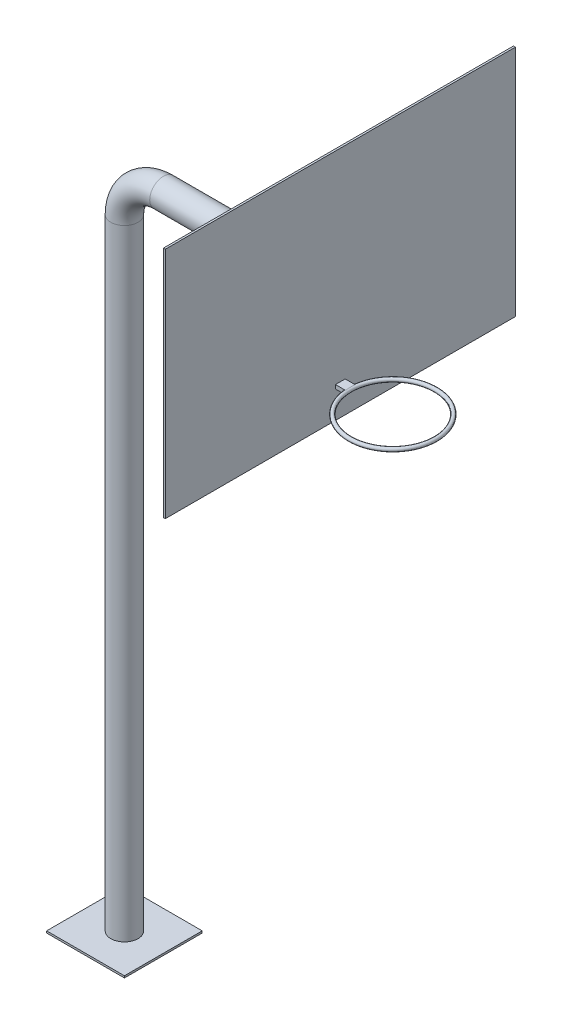
ISO-10303-21;
HEADER;
FILE_DESCRIPTION(('STEP AP214'),'2;1');
FILE_NAME('part.step','',(''),(''),'','','');
FILE_SCHEMA(('AUTOMOTIVE_DESIGN { 1 0 10303 214 1 1 1 1 }'));
ENDSEC;
DATA;
#1=APPLICATION_CONTEXT('core data for automotive mechanical design processes');
#2=APPLICATION_PROTOCOL_DEFINITION('international standard','automotive_design',2000,#1);
#3=PRODUCT_CONTEXT('',#1,'mechanical');
#4=PRODUCT('Part','Part','',(#3));
#5=PRODUCT_RELATED_PRODUCT_CATEGORY('part','',(#4));
#6=PRODUCT_DEFINITION_FORMATION('','',#4);
#7=PRODUCT_DEFINITION_CONTEXT('part definition',#1,'design');
#8=PRODUCT_DEFINITION('design','',#6,#7);
#9=PRODUCT_DEFINITION_SHAPE('','',#8);
#10=(LENGTH_UNIT() NAMED_UNIT(*) SI_UNIT(.MILLI.,.METRE.));
#11=(NAMED_UNIT(*) PLANE_ANGLE_UNIT() SI_UNIT($,.RADIAN.));
#12=(NAMED_UNIT(*) SI_UNIT($,.STERADIAN.) SOLID_ANGLE_UNIT());
#13=UNCERTAINTY_MEASURE_WITH_UNIT(LENGTH_MEASURE(1.E-05),#10,'distance_accuracy_value','');
#14=(GEOMETRIC_REPRESENTATION_CONTEXT(3) GLOBAL_UNCERTAINTY_ASSIGNED_CONTEXT((#13)) GLOBAL_UNIT_ASSIGNED_CONTEXT((#10,
#11,#12)) REPRESENTATION_CONTEXT('',''));
#15=CARTESIAN_POINT('',(0.,0.,0.));
#16=DIRECTION('',(0.,0.,1.));
#17=DIRECTION('',(1.,0.,0.));
#18=AXIS2_PLACEMENT_3D('',#15,#16,#17);
#19=CARTESIAN_POINT('',(1110.,6.15556988097725E-13,0.));
#20=DIRECTION('',(1.,0.,0.));
#21=DIRECTION('',(0.,1.,0.));
#22=AXIS2_PLACEMENT_3D('',#19,#20,#21);
#23=PLANE('',#22);
#24=DIRECTION('',(0.,1.,0.));
#25=VECTOR('',#24,1.);
#26=CARTESIAN_POINT('',(1110.,4050.,-900.));
#27=LINE('',#26,#25);
#28=CARTESIAN_POINT('',(1110.,2850.,-900.));
#29=VERTEX_POINT('',#28);
#30=CARTESIAN_POINT('',(1110.,4050.,-900.));
#31=VERTEX_POINT('',#30);
#32=EDGE_CURVE('E499',#29,#31,#27,.T.);
#33=ORIENTED_EDGE('',*,*,#32,.T.);
#34=DIRECTION('',(0.,0.,1.));
#35=VECTOR('',#34,1.);
#36=CARTESIAN_POINT('',(1110.,4050.,900.));
#37=LINE('',#36,#35);
#38=CARTESIAN_POINT('',(1110.,4050.,900.));
#39=VERTEX_POINT('',#38);
#40=EDGE_CURVE('E502',#31,#39,#37,.T.);
#41=ORIENTED_EDGE('',*,*,#40,.T.);
#42=DIRECTION('',(0.,-1.,0.));
#43=VECTOR('',#42,1.);
#44=CARTESIAN_POINT('',(1110.,4050.,900.));
#45=LINE('',#44,#43);
#46=CARTESIAN_POINT('',(1110.,2850.,900.));
#47=VERTEX_POINT('',#46);
#48=EDGE_CURVE('E505',#39,#47,#45,.T.);
#49=ORIENTED_EDGE('',*,*,#48,.T.);
#50=DIRECTION('',(0.,0.,-1.));
#51=VECTOR('',#50,1.);
#52=CARTESIAN_POINT('',(1110.,2850.,900.));
#53=LINE('',#52,#51);
#54=EDGE_CURVE('E507',#47,#29,#53,.T.);
#55=ORIENTED_EDGE('',*,*,#54,.T.);
#56=EDGE_LOOP('',(#33,#41,#49,#55));
#57=FACE_BOUND('',#56,.T.);
#58=DIRECTION('',(0.,-1.,0.));
#59=VECTOR('',#58,1.);
#60=CARTESIAN_POINT('',(1110.,3010.,25.0000000000003));
#61=LINE('',#60,#59);
#62=CARTESIAN_POINT('',(1110.,3010.,25.0000000000003));
#63=VERTEX_POINT('',#62);
#64=CARTESIAN_POINT('',(1110.,2990.,25.0000000000003));
#65=VERTEX_POINT('',#64);
#66=EDGE_CURVE('E55',#63,#65,#61,.T.);
#67=ORIENTED_EDGE('',*,*,#66,.F.);
#68=DIRECTION('',(0.,0.,1.));
#69=VECTOR('',#68,1.);
#70=CARTESIAN_POINT('',(1110.,3010.,25.0000000000003));
#71=LINE('',#70,#69);
#72=CARTESIAN_POINT('',(1110.,3010.,-24.9999999999997));
#73=VERTEX_POINT('',#72);
#74=EDGE_CURVE('E162',#73,#63,#71,.T.);
#75=ORIENTED_EDGE('',*,*,#74,.F.);
#76=DIRECTION('',(0.,1.,0.));
#77=VECTOR('',#76,1.);
#78=CARTESIAN_POINT('',(1110.,3010.,-24.9999999999997));
#79=LINE('',#78,#77);
#80=CARTESIAN_POINT('',(1110.,2990.,-24.9999999999997));
#81=VERTEX_POINT('',#80);
#82=EDGE_CURVE('E514',#81,#73,#79,.T.);
#83=ORIENTED_EDGE('',*,*,#82,.F.);
#84=DIRECTION('',(0.,0.,-1.));
#85=VECTOR('',#84,1.);
#86=CARTESIAN_POINT('',(1110.,2990.,25.0000000000003));
#87=LINE('',#86,#85);
#88=EDGE_CURVE('E160',#65,#81,#87,.T.);
#89=ORIENTED_EDGE('',*,*,#88,.F.);
#90=EDGE_LOOP('',(#67,#75,#83,#89));
#91=FACE_BOUND('',#90,.T.);
#92=ADVANCED_FACE('F37',(#57,#91),#23,.T.);
#93=CARTESIAN_POINT('',(0.,10.,0.));
#94=DIRECTION('',(0.,1.,0.));
#95=DIRECTION('',(0.,0.,1.));
#96=AXIS2_PLACEMENT_3D('',#93,#94,#95);
#97=PLANE('',#96);
#98=DIRECTION('',(0.,0.,-1.));
#99=VECTOR('',#98,1.);
#100=CARTESIAN_POINT('',(200.,10.,-200.));
#101=LINE('',#100,#99);
#102=CARTESIAN_POINT('',(200.,10.,200.));
#103=VERTEX_POINT('',#102);
#104=CARTESIAN_POINT('',(200.,10.,-200.));
#105=VERTEX_POINT('',#104);
#106=EDGE_CURVE('E275',#103,#105,#101,.T.);
#107=ORIENTED_EDGE('',*,*,#106,.T.);
#108=DIRECTION('',(-1.,0.,0.));
#109=VECTOR('',#108,1.);
#110=CARTESIAN_POINT('',(-200.,10.,-200.));
#111=LINE('',#110,#109);
#112=CARTESIAN_POINT('',(-200.,10.,-200.));
#113=VERTEX_POINT('',#112);
#114=EDGE_CURVE('E93',#105,#113,#111,.T.);
#115=ORIENTED_EDGE('',*,*,#114,.T.);
#116=DIRECTION('',(0.,0.,1.));
#117=VECTOR('',#116,1.);
#118=CARTESIAN_POINT('',(-200.,10.,-200.));
#119=LINE('',#118,#117);
#120=CARTESIAN_POINT('',(-200.,10.,200.));
#121=VERTEX_POINT('',#120);
#122=EDGE_CURVE('E272',#113,#121,#119,.T.);
#123=ORIENTED_EDGE('',*,*,#122,.T.);
#124=DIRECTION('',(1.,0.,0.));
#125=VECTOR('',#124,1.);
#126=CARTESIAN_POINT('',(-200.,10.,200.));
#127=LINE('',#126,#125);
#128=EDGE_CURVE('E64',#121,#103,#127,.T.);
#129=ORIENTED_EDGE('',*,*,#128,.T.);
#130=EDGE_LOOP('',(#107,#115,#123,#129));
#131=FACE_BOUND('',#130,.T.);
#132=CARTESIAN_POINT('',(0.,10.,0.));
#133=DIRECTION('',(0.,1.,0.));
#134=DIRECTION('',(0.,0.,1.));
#135=AXIS2_PLACEMENT_3D('',#132,#133,#134);
#136=CIRCLE('',#135,70.);
#137=CARTESIAN_POINT('',(0.,10.,70.));
#138=VERTEX_POINT('',#137);
#139=EDGE_CURVE('E11',#138,#138,#136,.T.);
#140=ORIENTED_EDGE('',*,*,#139,.F.);
#141=EDGE_LOOP('',(#140));
#142=FACE_BOUND('',#141,.T.);
#143=ADVANCED_FACE('F192',(#131,#142),#97,.T.);
#144=CARTESIAN_POINT('',(200.,10.,-200.));
#145=DIRECTION('',(-1.,0.,0.));
#146=DIRECTION('',(0.,0.,1.));
#147=AXIS2_PLACEMENT_3D('',#144,#145,#146);
#148=PLANE('',#147);
#149=DIRECTION('',(0.,0.,-1.));
#150=VECTOR('',#149,1.);
#151=CARTESIAN_POINT('',(200.,0.,-200.));
#152=LINE('',#151,#150);
#153=CARTESIAN_POINT('',(200.,0.,200.));
#154=VERTEX_POINT('',#153);
#155=CARTESIAN_POINT('',(200.,0.,-200.));
#156=VERTEX_POINT('',#155);
#157=EDGE_CURVE('E269',#154,#156,#152,.T.);
#158=ORIENTED_EDGE('',*,*,#157,.T.);
#159=DIRECTION('',(0.,-1.,0.));
#160=VECTOR('',#159,1.);
#161=CARTESIAN_POINT('',(200.,10.,-200.));
#162=LINE('',#161,#160);
#163=EDGE_CURVE('E41',#105,#156,#162,.T.);
#164=ORIENTED_EDGE('',*,*,#163,.F.);
#165=ORIENTED_EDGE('',*,*,#106,.F.);
#166=DIRECTION('',(0.,-1.,0.));
#167=VECTOR('',#166,1.);
#168=CARTESIAN_POINT('',(200.,10.,200.));
#169=LINE('',#168,#167);
#170=EDGE_CURVE('E279',#103,#154,#169,.T.);
#171=ORIENTED_EDGE('',*,*,#170,.T.);
#172=EDGE_LOOP('',(#158,#164,#165,#171));
#173=FACE_BOUND('',#172,.T.);
#174=ADVANCED_FACE('F39',(#173),#148,.F.);
#175=CARTESIAN_POINT('',(-200.,10.,-200.));
#176=DIRECTION('',(0.,0.,1.));
#177=DIRECTION('',(1.,0.,0.));
#178=AXIS2_PLACEMENT_3D('',#175,#176,#177);
#179=PLANE('',#178);
#180=DIRECTION('',(-1.,0.,0.));
#181=VECTOR('',#180,1.);
#182=CARTESIAN_POINT('',(-200.,0.,-200.));
#183=LINE('',#182,#181);
#184=CARTESIAN_POINT('',(-200.,0.,-200.));
#185=VERTEX_POINT('',#184);
#186=EDGE_CURVE('E260',#156,#185,#183,.T.);
#187=ORIENTED_EDGE('',*,*,#186,.T.);
#188=DIRECTION('',(0.,-1.,0.));
#189=VECTOR('',#188,1.);
#190=CARTESIAN_POINT('',(-200.,10.,-200.));
#191=LINE('',#190,#189);
#192=EDGE_CURVE('E262',#113,#185,#191,.T.);
#193=ORIENTED_EDGE('',*,*,#192,.F.);
#194=ORIENTED_EDGE('',*,*,#114,.F.);
#195=ORIENTED_EDGE('',*,*,#163,.T.);
#196=EDGE_LOOP('',(#187,#193,#194,#195));
#197=FACE_BOUND('',#196,.T.);
#198=ADVANCED_FACE('F253',(#197),#179,.F.);
#199=CARTESIAN_POINT('',(-200.,10.,-200.));
#200=DIRECTION('',(1.,0.,0.));
#201=DIRECTION('',(0.,0.,-1.));
#202=AXIS2_PLACEMENT_3D('',#199,#200,#201);
#203=PLANE('',#202);
#204=DIRECTION('',(0.,0.,1.));
#205=VECTOR('',#204,1.);
#206=CARTESIAN_POINT('',(-200.,0.,-200.));
#207=LINE('',#206,#205);
#208=CARTESIAN_POINT('',(-200.,0.,200.));
#209=VERTEX_POINT('',#208);
#210=EDGE_CURVE('E268',#185,#209,#207,.T.);
#211=ORIENTED_EDGE('',*,*,#210,.T.);
#212=DIRECTION('',(0.,-1.,0.));
#213=VECTOR('',#212,1.);
#214=CARTESIAN_POINT('',(-200.,10.,200.));
#215=LINE('',#214,#213);
#216=EDGE_CURVE('E273',#121,#209,#215,.T.);
#217=ORIENTED_EDGE('',*,*,#216,.F.);
#218=ORIENTED_EDGE('',*,*,#122,.F.);
#219=ORIENTED_EDGE('',*,*,#192,.T.);
#220=EDGE_LOOP('',(#211,#217,#218,#219));
#221=FACE_BOUND('',#220,.T.);
#222=ADVANCED_FACE('F251',(#221),#203,.F.);
#223=CARTESIAN_POINT('',(-200.,10.,200.));
#224=DIRECTION('',(0.,0.,-1.));
#225=DIRECTION('',(-1.,0.,0.));
#226=AXIS2_PLACEMENT_3D('',#223,#224,#225);
#227=PLANE('',#226);
#228=DIRECTION('',(1.,0.,0.));
#229=VECTOR('',#228,1.);
#230=CARTESIAN_POINT('',(-200.,0.,200.));
#231=LINE('',#230,#229);
#232=EDGE_CURVE('E85',#209,#154,#231,.T.);
#233=ORIENTED_EDGE('',*,*,#232,.T.);
#234=ORIENTED_EDGE('',*,*,#170,.F.);
#235=ORIENTED_EDGE('',*,*,#128,.F.);
#236=ORIENTED_EDGE('',*,*,#216,.T.);
#237=EDGE_LOOP('',(#233,#234,#235,#236));
#238=FACE_BOUND('',#237,.T.);
#239=ADVANCED_FACE('F247',(#238),#227,.F.);
#240=CARTESIAN_POINT('',(0.,0.,0.));
#241=DIRECTION('',(0.,1.,0.));
#242=DIRECTION('',(0.,0.,1.));
#243=AXIS2_PLACEMENT_3D('',#240,#241,#242);
#244=PLANE('',#243);
#245=ORIENTED_EDGE('',*,*,#157,.F.);
#246=ORIENTED_EDGE('',*,*,#232,.F.);
#247=ORIENTED_EDGE('',*,*,#210,.F.);
#248=ORIENTED_EDGE('',*,*,#186,.F.);
#249=EDGE_LOOP('',(#245,#246,#247,#248));
#250=FACE_BOUND('',#249,.T.);
#251=ADVANCED_FACE('F235',(#250),#244,.F.);
#252=CARTESIAN_POINT('',(0.,0.,0.));
#253=DIRECTION('',(0.,1.,0.));
#254=DIRECTION('',(0.,0.,1.));
#255=AXIS2_PLACEMENT_3D('',#252,#253,#254);
#256=CYLINDRICAL_SURFACE('',#255,70.);
#257=ORIENTED_EDGE('',*,*,#139,.T.);
#258=EDGE_LOOP('',(#257));
#259=FACE_BOUND('',#258,.T.);
#260=CARTESIAN_POINT('',(0.,3200.,0.));
#261=DIRECTION('',(0.,1.,0.));
#262=DIRECTION('',(0.,0.,1.));
#263=AXIS2_PLACEMENT_3D('',#260,#261,#262);
#264=CIRCLE('',#263,70.);
#265=CARTESIAN_POINT('',(-70.0000000000001,3200.,0.));
#266=VERTEX_POINT('',#265);
#267=EDGE_CURVE('E300',#266,#266,#264,.T.);
#268=ORIENTED_EDGE('',*,*,#267,.F.);
#269=EDGE_LOOP('',(#268));
#270=FACE_BOUND('',#269,.T.);
#271=ADVANCED_FACE('F201',(#259,#270),#256,.T.);
#272=CARTESIAN_POINT('',(200.,3200.,0.));
#273=DIRECTION('',(0.,0.,-1.));
#274=DIRECTION('',(-1.,0.,0.));
#275=AXIS2_PLACEMENT_3D('',#272,#273,#274);
#276=TOROIDAL_SURFACE('',#275,200.,70.);
#277=CARTESIAN_POINT('',(200.,3400.,0.));
#278=DIRECTION('',(1.,0.,0.));
#279=DIRECTION('',(0.,0.,1.));
#280=AXIS2_PLACEMENT_3D('',#277,#278,#279);
#281=CIRCLE('',#280,70.);
#282=CARTESIAN_POINT('',(200.,3470.,0.));
#283=VERTEX_POINT('',#282);
#284=EDGE_CURVE('E299',#283,#283,#281,.T.);
#285=CARTESIAN_POINT('',(200.,3200.,0.));
#286=DIRECTION('',(0.,0.,-1.));
#287=DIRECTION('',(-1.,0.,0.));
#288=AXIS2_PLACEMENT_3D('',#285,#286,#287);
#289=CIRCLE('',#288,270.);
#290=EDGE_CURVE('',#266,#283,#289,.T.);
#291=ORIENTED_EDGE('',*,*,#267,.T.);
#292=ORIENTED_EDGE('',*,*,#284,.F.);
#293=ORIENTED_EDGE('',*,*,#290,.T.);
#294=ORIENTED_EDGE('',*,*,#290,.F.);
#295=EDGE_LOOP('',(#291,#293,#292,#294));
#296=FACE_BOUND('',#295,.T.);
#297=ADVANCED_FACE('F234',(#296),#276,.T.);
#298=CARTESIAN_POINT('',(200.,3400.,0.));
#299=DIRECTION('',(1.,0.,0.));
#300=DIRECTION('',(0.,1.,0.));
#301=AXIS2_PLACEMENT_3D('',#298,#299,#300);
#302=CYLINDRICAL_SURFACE('',#301,70.);
#303=CARTESIAN_POINT('',(1100.,3400.,0.));
#304=DIRECTION('',(1.,0.,0.));
#305=DIRECTION('',(0.,0.,1.));
#306=AXIS2_PLACEMENT_3D('',#303,#304,#305);
#307=CIRCLE('',#306,70.);
#308=CARTESIAN_POINT('',(1100.,3400.,70.));
#309=VERTEX_POINT('',#308);
#310=EDGE_CURVE('E296',#309,#309,#307,.T.);
#311=ORIENTED_EDGE('',*,*,#310,.F.);
#312=EDGE_LOOP('',(#311));
#313=FACE_BOUND('',#312,.T.);
#314=ORIENTED_EDGE('',*,*,#284,.T.);
#315=EDGE_LOOP('',(#314));
#316=FACE_BOUND('',#315,.T.);
#317=ADVANCED_FACE('F198',(#313,#316),#302,.T.);
#318=CARTESIAN_POINT('',(1100.,6.10622663543835E-13,0.));
#319=DIRECTION('',(1.,0.,0.));
#320=DIRECTION('',(0.,1.,0.));
#321=AXIS2_PLACEMENT_3D('',#318,#319,#320);
#322=PLANE('',#321);
#323=ORIENTED_EDGE('',*,*,#310,.T.);
#324=EDGE_LOOP('',(#323));
#325=FACE_BOUND('',#324,.T.);
#326=DIRECTION('',(0.,1.,0.));
#327=VECTOR('',#326,1.);
#328=CARTESIAN_POINT('',(1100.,4050.,-900.));
#329=LINE('',#328,#327);
#330=CARTESIAN_POINT('',(1100.,2850.,-900.));
#331=VERTEX_POINT('',#330);
#332=CARTESIAN_POINT('',(1100.,4050.,-900.));
#333=VERTEX_POINT('',#332);
#334=EDGE_CURVE('E510',#331,#333,#329,.T.);
#335=ORIENTED_EDGE('',*,*,#334,.F.);
#336=DIRECTION('',(0.,0.,-1.));
#337=VECTOR('',#336,1.);
#338=CARTESIAN_POINT('',(1100.,2850.,900.));
#339=LINE('',#338,#337);
#340=CARTESIAN_POINT('',(1100.,2850.,900.));
#341=VERTEX_POINT('',#340);
#342=EDGE_CURVE('E503',#341,#331,#339,.T.);
#343=ORIENTED_EDGE('',*,*,#342,.F.);
#344=DIRECTION('',(0.,-1.,0.));
#345=VECTOR('',#344,1.);
#346=CARTESIAN_POINT('',(1100.,4050.,900.));
#347=LINE('',#346,#345);
#348=CARTESIAN_POINT('',(1100.,4050.,900.));
#349=VERTEX_POINT('',#348);
#350=EDGE_CURVE('E516',#349,#341,#347,.T.);
#351=ORIENTED_EDGE('',*,*,#350,.F.);
#352=DIRECTION('',(0.,0.,1.));
#353=VECTOR('',#352,1.);
#354=CARTESIAN_POINT('',(1100.,4050.,900.));
#355=LINE('',#354,#353);
#356=EDGE_CURVE('E513',#333,#349,#355,.T.);
#357=ORIENTED_EDGE('',*,*,#356,.F.);
#358=EDGE_LOOP('',(#335,#343,#351,#357));
#359=FACE_BOUND('',#358,.T.);
#360=ADVANCED_FACE('F194',(#325,#359),#322,.F.);
#361=CARTESIAN_POINT('',(1110.,2850.,900.));
#362=DIRECTION('',(0.,1.,0.));
#363=DIRECTION('',(-1.,0.,0.));
#364=AXIS2_PLACEMENT_3D('',#361,#362,#363);
#365=PLANE('',#364);
#366=ORIENTED_EDGE('',*,*,#342,.T.);
#367=DIRECTION('',(-1.,0.,0.));
#368=VECTOR('',#367,1.);
#369=CARTESIAN_POINT('',(1110.,2850.,-900.));
#370=LINE('',#369,#368);
#371=EDGE_CURVE('E509',#29,#331,#370,.T.);
#372=ORIENTED_EDGE('',*,*,#371,.F.);
#373=ORIENTED_EDGE('',*,*,#54,.F.);
#374=DIRECTION('',(-1.,0.,0.));
#375=VECTOR('',#374,1.);
#376=CARTESIAN_POINT('',(1110.,2850.,900.));
#377=LINE('',#376,#375);
#378=EDGE_CURVE('E521',#47,#341,#377,.T.);
#379=ORIENTED_EDGE('',*,*,#378,.T.);
#380=EDGE_LOOP('',(#366,#372,#373,#379));
#381=FACE_BOUND('',#380,.T.);
#382=ADVANCED_FACE('F197',(#381),#365,.F.);
#383=CARTESIAN_POINT('',(1110.,4050.,900.));
#384=DIRECTION('',(0.,0.,-1.));
#385=DIRECTION('',(0.,1.,0.));
#386=AXIS2_PLACEMENT_3D('',#383,#384,#385);
#387=PLANE('',#386);
#388=ORIENTED_EDGE('',*,*,#350,.T.);
#389=ORIENTED_EDGE('',*,*,#378,.F.);
#390=ORIENTED_EDGE('',*,*,#48,.F.);
#391=DIRECTION('',(-1.,0.,0.));
#392=VECTOR('',#391,1.);
#393=CARTESIAN_POINT('',(1110.,4050.,900.));
#394=LINE('',#393,#392);
#395=EDGE_CURVE('E524',#39,#349,#394,.T.);
#396=ORIENTED_EDGE('',*,*,#395,.T.);
#397=EDGE_LOOP('',(#388,#389,#390,#396));
#398=FACE_BOUND('',#397,.T.);
#399=ADVANCED_FACE('F204',(#398),#387,.F.);
#400=CARTESIAN_POINT('',(1110.,4050.,900.));
#401=DIRECTION('',(0.,-1.,0.));
#402=DIRECTION('',(1.,0.,0.));
#403=AXIS2_PLACEMENT_3D('',#400,#401,#402);
#404=PLANE('',#403);
#405=ORIENTED_EDGE('',*,*,#356,.T.);
#406=ORIENTED_EDGE('',*,*,#395,.F.);
#407=ORIENTED_EDGE('',*,*,#40,.F.);
#408=DIRECTION('',(-1.,0.,0.));
#409=VECTOR('',#408,1.);
#410=CARTESIAN_POINT('',(1110.,4050.,-900.));
#411=LINE('',#410,#409);
#412=EDGE_CURVE('E303',#31,#333,#411,.T.);
#413=ORIENTED_EDGE('',*,*,#412,.T.);
#414=EDGE_LOOP('',(#405,#406,#407,#413));
#415=FACE_BOUND('',#414,.T.);
#416=ADVANCED_FACE('F208',(#415),#404,.F.);
#417=CARTESIAN_POINT('',(1110.,4050.,-900.));
#418=DIRECTION('',(0.,0.,1.));
#419=DIRECTION('',(0.,-1.,0.));
#420=AXIS2_PLACEMENT_3D('',#417,#418,#419);
#421=PLANE('',#420);
#422=ORIENTED_EDGE('',*,*,#334,.T.);
#423=ORIENTED_EDGE('',*,*,#412,.F.);
#424=ORIENTED_EDGE('',*,*,#32,.F.);
#425=ORIENTED_EDGE('',*,*,#371,.T.);
#426=EDGE_LOOP('',(#422,#423,#424,#425));
#427=FACE_BOUND('',#426,.T.);
#428=ADVANCED_FACE('F212',(#427),#421,.F.);
#429=CARTESIAN_POINT('',(1610.002,3010.,25.0000000000003));
#430=DIRECTION('',(0.,-1.,0.));
#431=DIRECTION('',(1.,0.,0.));
#432=AXIS2_PLACEMENT_3D('',#429,#430,#431);
#433=PLANE('',#432);
#434=CARTESIAN_POINT('',(1380.,3010.,0.));
#435=DIRECTION('',(0.,1.,0.));
#436=DIRECTION('',(-1.,0.,0.));
#437=AXIS2_PLACEMENT_3D('',#434,#435,#436);
#438=CIRCLE('',#437,220.);
#439=CARTESIAN_POINT('',(1161.42507005605,3010.,-24.9999999999997));
#440=VERTEX_POINT('',#439);
#441=CARTESIAN_POINT('',(1161.42507005607,3010.,25.0000000000003));
#442=VERTEX_POINT('',#441);
#443=EDGE_CURVE('E156',#440,#442,#438,.T.);
#444=ORIENTED_EDGE('',*,*,#443,.F.);
#445=DIRECTION('',(-1.,0.,0.));
#446=VECTOR('',#445,1.);
#447=CARTESIAN_POINT('',(1610.002,3010.,-24.9999999999997));
#448=LINE('',#447,#446);
#449=EDGE_CURVE('E148',#440,#73,#448,.T.);
#450=ORIENTED_EDGE('',*,*,#449,.T.);
#451=ORIENTED_EDGE('',*,*,#74,.T.);
#452=DIRECTION('',(-1.,0.,0.));
#453=VECTOR('',#452,1.);
#454=CARTESIAN_POINT('',(1610.002,3010.,25.0000000000003));
#455=LINE('',#454,#453);
#456=EDGE_CURVE('E167',#442,#63,#455,.T.);
#457=ORIENTED_EDGE('',*,*,#456,.F.);
#458=EDGE_LOOP('',(#444,#450,#451,#457));
#459=FACE_BOUND('',#458,.T.);
#460=ADVANCED_FACE('F216',(#459),#433,.F.);
#461=CARTESIAN_POINT('',(1610.002,3010.,25.0000000000003));
#462=DIRECTION('',(0.,0.,-1.));
#463=DIRECTION('',(0.,1.,0.));
#464=AXIS2_PLACEMENT_3D('',#461,#462,#463);
#465=PLANE('',#464);
#466=DIRECTION('',(-1.,0.,0.));
#467=VECTOR('',#466,1.);
#468=CARTESIAN_POINT('',(1610.002,2990.,25.0000000000003));
#469=LINE('',#468,#467);
#470=CARTESIAN_POINT('',(1161.42507005605,2990.,25.0000000000003));
#471=VERTEX_POINT('',#470);
#472=EDGE_CURVE('E163',#471,#65,#469,.T.);
#473=ORIENTED_EDGE('',*,*,#472,.F.);
#474=CARTESIAN_POINT('',(1154.17574059056,2993.06427125079,25.000000000007));
#475=CARTESIAN_POINT('',(1153.98057311985,2993.26574968859,25.0000000000064));
#476=CARTESIAN_POINT('',(1153.79389360427,2993.47539928354,25.0000000000019));
#477=CARTESIAN_POINT('',(1153.43873690573,2993.90970014024,24.9999999999987));
#478=CARTESIAN_POINT('',(1153.2702642432,2994.13435510526,24.9999999999998));
#479=CARTESIAN_POINT('',(1152.95265114937,2994.59727111985,25.0000000000007));
#480=CARTESIAN_POINT('',(1152.80353059768,2994.83554580418,25.0000000000004));
#481=CARTESIAN_POINT('',(1152.52590647761,2995.32381764618,25.0000000000002));
#482=CARTESIAN_POINT('',(1152.39740274881,2995.57381471263,25.0000000000003));
#483=CARTESIAN_POINT('',(1152.16198528606,2996.08369410972,25.0000000000003));
#484=CARTESIAN_POINT('',(1152.05506573636,2996.34357375507,25.0000000000003));
#485=CARTESIAN_POINT('',(1151.86355736296,2996.87144000924,25.0000000000003));
#486=CARTESIAN_POINT('',(1151.7789688846,2997.13942674335,25.0000000000003));
#487=CARTESIAN_POINT('',(1151.63276701615,2997.68152514023,25.0000000000003));
#488=CARTESIAN_POINT('',(1151.57114796599,2997.95563527643,25.0000000000003));
#489=CARTESIAN_POINT('',(1151.4713114432,2998.5080834594,25.0000000000003));
#490=CARTESIAN_POINT('',(1151.43309382714,2998.78642148025,25.0000000000003));
#491=CARTESIAN_POINT('',(1151.38042215776,2999.3444901357,25.0000000000003));
#492=CARTESIAN_POINT('',(1151.36589684887,2999.62421404718,25.0000000000003));
#493=CARTESIAN_POINT('',(1151.36049465327,3000.18389006741,25.0000000000003));
#494=CARTESIAN_POINT('',(1151.36961773942,3000.4638421759,25.0000000000003));
#495=CARTESIAN_POINT('',(1151.41144560322,3001.02198595776,25.0000000000003));
#496=CARTESIAN_POINT('',(1151.4441509709,3001.30017758691,25.0000000000003));
#497=CARTESIAN_POINT('',(1151.53290317313,3001.85281195859,25.0000000000003));
#498=CARTESIAN_POINT('',(1151.58895000059,3002.12725470227,25.0000000000003));
#499=CARTESIAN_POINT('',(1151.72389189045,3002.67011398962,25.0000000000003));
#500=CARTESIAN_POINT('',(1151.80275946981,3002.9385373659,25.0000000000003));
#501=CARTESIAN_POINT('',(1151.98279170323,3003.46779866074,25.0000000000003));
#502=CARTESIAN_POINT('',(1152.08395632675,3003.72863658969,25.0000000000003));
#503=CARTESIAN_POINT('',(1152.30784509844,3004.24088922266,25.0000000000003));
#504=CARTESIAN_POINT('',(1152.43056928038,3004.49230391192,25.0000000000003));
#505=CARTESIAN_POINT('',(1152.69668574587,3004.98394567944,25.0000000000003));
#506=CARTESIAN_POINT('',(1152.8400780798,3005.22417273042,25.0000000000003));
#507=CARTESIAN_POINT('',(1153.14687540781,3005.69234333042,25.0000000000003));
#508=CARTESIAN_POINT('',(1153.31032929195,3005.9202548407,25.0000000000003));
#509=CARTESIAN_POINT('',(1153.6557843771,3006.36155773003,25.0000000000003));
#510=CARTESIAN_POINT('',(1153.837785596,3006.57494909509,25.0000000000003));
#511=CARTESIAN_POINT('',(1154.21902971736,3006.98573481318,25.0000000000003));
#512=CARTESIAN_POINT('',(1154.41827288543,3007.18312891967,25.0000000000003));
#513=CARTESIAN_POINT('',(1154.83257430456,3007.5605564053,25.0000000000003));
#514=CARTESIAN_POINT('',(1155.04763261504,3007.74058971921,25.0000000000003));
#515=CARTESIAN_POINT('',(1155.49319441166,3008.08295280255,25.0000000000003));
#516=CARTESIAN_POINT('',(1155.72377253866,3008.24518543627,25.0000000000003));
#517=CARTESIAN_POINT('',(1156.19771813631,3008.54974748204,25.0000000000003));
#518=CARTESIAN_POINT('',(1156.44108564547,3008.69207683417,25.0000000000003));
#519=CARTESIAN_POINT('',(1156.93888507743,3008.95586227499,25.0000000000003));
#520=CARTESIAN_POINT('',(1157.19331715217,3009.0773180769,25.0000000000003));
#521=CARTESIAN_POINT('',(1157.71145148375,3009.29853297199,25.0000000000003));
#522=CARTESIAN_POINT('',(1157.97515399077,3009.39829147909,25.0000000000003));
#523=CARTESIAN_POINT('',(1158.51155116258,3009.57595923233,25.0000000000003));
#524=CARTESIAN_POINT('',(1158.78428976715,3009.65373583846,25.0000000000003));
#525=CARTESIAN_POINT('',(1159.33533261387,3009.78612314699,25.0000000000003));
#526=CARTESIAN_POINT('',(1159.61363687785,3009.84073375853,25.0000000000003));
#527=CARTESIAN_POINT('',(1160.17385388326,3009.92642260704,25.0000000000003));
#528=CARTESIAN_POINT('',(1160.45576674086,3009.95750008443,25.0000000000003));
#529=CARTESIAN_POINT('',(1161.02119955453,3009.995912347,25.0000000000003));
#530=CARTESIAN_POINT('',(1161.30471948088,3010.00324756976,25.0000000000003));
#531=CARTESIAN_POINT('',(1161.87256994444,3009.99411120097,25.0000000000003));
#532=CARTESIAN_POINT('',(1162.15689887272,3009.97753930618,25.0000000000003));
#533=CARTESIAN_POINT('',(1162.72315382476,3009.92052365035,25.0000000000003));
#534=CARTESIAN_POINT('',(1163.00507984062,3009.880079811,25.0000000000003));
#535=CARTESIAN_POINT('',(1163.56452917355,3009.77559904937,25.0000000000003));
#536=CARTESIAN_POINT('',(1163.84205244434,3009.71156187923,25.0000000000003));
#537=CARTESIAN_POINT('',(1164.390717905,3009.56033542558,25.0000000000003));
#538=CARTESIAN_POINT('',(1164.66186009944,3009.47314615859,25.0000000000003));
#539=CARTESIAN_POINT('',(1165.19596459826,3009.27616555464,25.0000000000003));
#540=CARTESIAN_POINT('',(1165.45892265166,3009.16636269011,25.0000000000003));
#541=CARTESIAN_POINT('',(1165.97462702544,3008.92494083376,25.0000000000003));
#542=CARTESIAN_POINT('',(1166.22737333388,3008.79332181643,25.0000000000003));
#543=CARTESIAN_POINT('',(1166.72082871692,3008.50918204915,25.0000000000003));
#544=CARTESIAN_POINT('',(1166.96153789105,3008.35666147209,25.0000000000003));
#545=CARTESIAN_POINT('',(1167.42917404633,3008.0317813711,25.0000000000003));
#546=CARTESIAN_POINT('',(1167.65610107505,3007.85942191564,25.0000000000003));
#547=CARTESIAN_POINT('',(1168.09370357453,3007.49674601129,25.0000000000003));
#548=CARTESIAN_POINT('',(1168.30443611213,3007.30649841924,25.0000000000003));
#549=CARTESIAN_POINT('',(1168.70903754493,3006.90884350774,25.0000000000003));
#550=CARTESIAN_POINT('',(1168.90290646847,3006.70143621715,25.0000000000003));
#551=CARTESIAN_POINT('',(1169.27235009425,3006.27093021224,25.0000000000003));
#552=CARTESIAN_POINT('',(1169.44792525063,3006.04783188768,25.0000000000003));
#553=CARTESIAN_POINT('',(1169.77948551453,3005.58752405195,25.0000000000003));
#554=CARTESIAN_POINT('',(1169.93547071559,3005.35031460818,25.0000000000003));
#555=CARTESIAN_POINT('',(1170.22574414549,3004.86505796014,25.0000000000003));
#556=CARTESIAN_POINT('',(1170.36016632165,3004.61709087496,25.0000000000003));
#557=CARTESIAN_POINT('',(1170.60752854442,3004.11066340312,25.0000000000003));
#558=CARTESIAN_POINT('',(1170.72046867658,3003.85220305825,25.0000000000003));
#559=CARTESIAN_POINT('',(1170.9240214543,3003.32664321915,25.0000000000003));
#560=CARTESIAN_POINT('',(1171.0146347691,3003.05954398414,25.0000000000003));
#561=CARTESIAN_POINT('',(1171.17285869927,3002.51861694191,25.0000000000003));
#562=CARTESIAN_POINT('',(1171.24046940108,3002.24478915998,25.0000000000003));
#563=CARTESIAN_POINT('',(1171.3518295006,3001.69410971803,25.0000000000003));
#564=CARTESIAN_POINT('',(1171.39572564409,3001.41728772475,25.0000000000003));
#565=CARTESIAN_POINT('',(1171.45997297353,3000.8609252892,25.0000000000003));
#566=CARTESIAN_POINT('',(1171.48032426446,3000.58138485906,25.0000000000003));
#567=CARTESIAN_POINT('',(1171.49732985704,3000.02158965533,25.0000000000003));
#568=CARTESIAN_POINT('',(1171.49398461659,2999.74133489564,25.0000000000003));
#569=CARTESIAN_POINT('',(1171.46362322611,2999.18211062842,25.0000000000003));
#570=CARTESIAN_POINT('',(1171.43660709604,2998.90314111981,25.0000000000003));
#571=CARTESIAN_POINT('',(1171.35922104462,2998.34930618041,25.0000000000003));
#572=CARTESIAN_POINT('',(1171.30892071703,2998.07443102183,25.0000000000003));
#573=CARTESIAN_POINT('',(1171.18536316069,2997.52989078707,25.0000000000003));
#574=CARTESIAN_POINT('',(1171.11210599444,2997.26022569671,25.0000000000003));
#575=CARTESIAN_POINT('',(1170.94317573122,2996.72801172515,25.0000000000003));
#576=CARTESIAN_POINT('',(1170.84750266398,2996.46546283452,25.0000000000003));
#577=CARTESIAN_POINT('',(1170.63444370073,2995.94932839803,25.0000000000003));
#578=CARTESIAN_POINT('',(1170.51705775327,2995.69574287341,25.0000000000003));
#579=CARTESIAN_POINT('',(1170.26120172195,2995.19886551088,25.0000000000003));
#580=CARTESIAN_POINT('',(1170.12269417251,2994.955592966,25.0000000000003));
#581=CARTESIAN_POINT('',(1169.82575978949,2994.48152576705,25.0000000000003));
#582=CARTESIAN_POINT('',(1169.66733294884,2994.2507311174,25.0000000000003));
#583=CARTESIAN_POINT('',(1169.33170613342,2993.80321974685,25.0000000000003));
#584=CARTESIAN_POINT('',(1169.15450600461,2993.58650314146,25.0000000000003));
#585=CARTESIAN_POINT('',(1168.78260351716,2993.1686386895,25.0000000000003));
#586=CARTESIAN_POINT('',(1168.58790066971,2992.96749127801,25.0000000000003));
#587=CARTESIAN_POINT('',(1168.18124656638,2992.58106565185,25.0000000000003));
#588=CARTESIAN_POINT('',(1167.96920454261,2992.39588295281,25.0000000000003));
#589=CARTESIAN_POINT('',(1167.53035082928,2992.04393535919,25.0000000000003));
#590=CARTESIAN_POINT('',(1167.30353909281,2991.87717052312,25.0000000000003));
#591=CARTESIAN_POINT('',(1166.83675364387,2991.56319400923,25.0000000000003));
#592=CARTESIAN_POINT('',(1166.59677951428,2991.41598295158,25.0000000000003));
#593=CARTESIAN_POINT('',(1166.10537450813,2991.14212144087,25.0000000000003));
#594=CARTESIAN_POINT('',(1165.85394363458,2991.01547098243,25.0000000000003));
#595=CARTESIAN_POINT('',(1165.33966490507,2990.78280569287,25.0000000000003));
#596=CARTESIAN_POINT('',(1165.0767515436,2990.67693563516,25.0000000000003));
#597=CARTESIAN_POINT('',(1164.54296951527,2990.48762604486,25.0000000000003));
#598=CARTESIAN_POINT('',(1164.27210081178,2990.40418661552,25.0000000000003));
#599=CARTESIAN_POINT('',(1163.72438474021,2990.26032387678,25.0000000000003));
#600=CARTESIAN_POINT('',(1163.4475387418,2990.19989535245,25.0000000000003));
#601=CARTESIAN_POINT('',(1162.88963970619,2990.10241881216,25.0000000000003));
#602=CARTESIAN_POINT('',(1162.60858492576,2990.06538077487,25.0000000000003));
#603=CARTESIAN_POINT('',(1162.04306113339,2990.01486375364,25.0000000000003));
#604=CARTESIAN_POINT('',(1161.75858236187,2990.00149396093,25.0000000000003));
#605=CARTESIAN_POINT('',(1161.18962914874,2989.99874338444,25.0000000000003));
#606=CARTESIAN_POINT('',(1160.90515475582,2990.00935249667,25.0000000000003));
#607=CARTESIAN_POINT('',(1160.337971577,2990.0544810095,25.0000000000003));
#608=CARTESIAN_POINT('',(1160.05526369915,2990.08901182588,25.0000000000003));
#609=CARTESIAN_POINT('',(1159.493765485,2990.18176251369,25.0000000000003));
#610=CARTESIAN_POINT('',(1159.2149750852,2990.23998200068,25.0000000000003));
#611=CARTESIAN_POINT('',(1158.66295384497,2990.37980067512,25.0000000000003));
#612=CARTESIAN_POINT('',(1158.38973025965,2990.4614285132,25.0000000000003));
#613=CARTESIAN_POINT('',(1157.85116006026,2990.64747304844,25.0000000000003));
#614=CARTESIAN_POINT('',(1157.58581333833,2990.75188943337,25.0000000000003));
#615=CARTESIAN_POINT('',(1157.06517624676,2990.98267174527,25.0000000000003));
#616=CARTESIAN_POINT('',(1156.80987543575,2991.10901410206,25.0000000000002));
#617=CARTESIAN_POINT('',(1156.31095778584,2991.38279732166,25.0000000000004));
#618=CARTESIAN_POINT('',(1156.06733788969,2991.53023262313,25.0000000000007));
#619=CARTESIAN_POINT('',(1155.53108182832,2991.88668444203,24.9999999999998));
#620=CARTESIAN_POINT('',(1155.24240632808,2992.10169866521,24.9999999999983));
#621=CARTESIAN_POINT('',(1154.68975675773,2992.56142835145,25.0000000000023));
#622=CARTESIAN_POINT('',(1154.42578265955,2992.80614378077,25.0000000000078));
#623=CARTESIAN_POINT('',(1154.17574059056,2993.06427125079,25.000000000007));
#624=B_SPLINE_CURVE_WITH_KNOTS('',3,(#474,#475,#476,#477,#478,#479,#480,#481,#482,#483,#484,
#485,#486,#487,#488,#489,#490,#491,#492,#493,#494,#495,#496,#497,#498,#499,#500,#501,#502,#503,
#504,#505,#506,#507,#508,#509,#510,#511,#512,#513,#514,#515,#516,#517,#518,#519,#520,#521,#522,
#523,#524,#525,#526,#527,#528,#529,#530,#531,#532,#533,#534,#535,#536,#537,#538,#539,#540,#541,
#542,#543,#544,#545,#546,#547,#548,#549,#550,#551,#552,#553,#554,#555,#556,#557,#558,#559,#560,
#561,#562,#563,#564,#565,#566,#567,#568,#569,#570,#571,#572,#573,#574,#575,#576,#577,#578,#579,
#580,#581,#582,#583,#584,#585,#586,#587,#588,#589,#590,#591,#592,#593,#594,#595,#596,#597,#598,
#599,#600,#601,#602,#603,#604,#605,#606,#607,#608,#609,#610,#611,#612,#613,#614,#615,#616,#617,
#618,#619,#620,#621,#622,#623),.UNSPECIFIED.,.T.,.F.,(4,2,2,2,2,2,2,2,2,2,2,2,2,2,2,2,2,2,2,2,2,
2,2,2,2,2,2,2,2,2,2,2,2,2,2,2,2,2,2,2,2,2,2,2,2,2,2,2,2,2,2,2,2,2,2,2,2,2,2,2,2,2,2,2,2,2,2,2,2,
2,2,2,2,2,4),(0.,0.841208734468507,1.6826258482432,2.52490058573988,3.36716876946264,
4.20920970450243,5.05126366057175,5.89310998253805,6.734951145025,7.57425573715193,
8.41355936672681,9.25288399698971,10.0922083727086,10.9305261268063,11.7688427323519,
12.6071606509135,13.4454806122782,14.2858857131685,15.1262916241925,15.9667104838958,
16.8071325015372,17.6519336939191,18.4967374301063,19.3415527717624,20.1863909304495,
21.0362230548883,21.8860585127085,22.7359213993485,23.5857686223617,24.4391917986407,
25.2926177744773,26.1460527161145,26.9994870483745,27.8533575109003,28.7072289716012,
29.5610933698387,30.4149548216401,31.265654484212,32.1163527167946,32.9670298258845,
33.8177028725961,34.6628678455562,35.5080294527268,36.3531657230475,37.1982988172923,
38.0381405146924,38.8779784671453,39.7178001913994,40.5576212076008,41.3949481446991,
42.232272802639,43.069596350471,43.9069218817806,44.7457503220433,45.5845790599285,
46.4234146809203,47.2622737356639,48.1058461429929,48.9494212305402,49.7930230669627,
50.6366246826196,51.4859097515831,52.3351987301415,53.1842951212362,54.0337535032406,
54.8871206684447,55.7401283175673,56.5935433146305,57.446944462146,58.3013946200549,
59.1558330722767,60.0093586390383,60.8626595796447,61.9403894419229,63.0181180800443),.UNSPECIFIED.);
#625=EDGE_CURVE('E145',#471,#442,#624,.T.);
#626=ORIENTED_EDGE('',*,*,#625,.T.);
#627=ORIENTED_EDGE('',*,*,#456,.T.);
#628=ORIENTED_EDGE('',*,*,#66,.T.);
#629=EDGE_LOOP('',(#473,#626,#627,#628));
#630=FACE_BOUND('',#629,.T.);
#631=ADVANCED_FACE('F184',(#630),#465,.F.);
#632=CARTESIAN_POINT('',(1610.002,3010.,-24.9999999999997));
#633=DIRECTION('',(0.,0.,1.));
#634=DIRECTION('',(0.,-1.,0.));
#635=AXIS2_PLACEMENT_3D('',#632,#633,#634);
#636=PLANE('',#635);
#637=ORIENTED_EDGE('',*,*,#449,.F.);
#638=CARTESIAN_POINT('',(1154.17574059057,2993.06427125079,-24.9999999999997));
#639=CARTESIAN_POINT('',(1154.37259363185,2992.86104687347,-24.9999999999997));
#640=CARTESIAN_POINT('',(1154.57803517189,2992.66618326026,-24.9999999999997));
#641=CARTESIAN_POINT('',(1155.00470587334,2992.29443387752,-24.9999999999997));
#642=CARTESIAN_POINT('',(1155.225939423,2992.11755313838,-24.9999999999997));
#643=CARTESIAN_POINT('',(1155.68278674621,2991.78289179056,-24.9999999999997));
#644=CARTESIAN_POINT('',(1155.91841641153,2991.625132885,-24.9999999999997));
#645=CARTESIAN_POINT('',(1156.4021399032,2991.33003418955,-24.9999999999997));
#646=CARTESIAN_POINT('',(1156.65023400209,2991.19269484643,-24.9999999999997));
#647=CARTESIAN_POINT('',(1157.15691324095,2990.93948111439,-24.9999999999997));
#648=CARTESIAN_POINT('',(1157.41549047539,2990.82359090425,-24.9999999999997));
#649=CARTESIAN_POINT('',(1157.94146991159,2990.61394046036,-24.9999999999997));
#650=CARTESIAN_POINT('',(1158.20887225485,2990.52018058163,-24.9999999999997));
#651=CARTESIAN_POINT('',(1158.75052934587,2990.35545232684,-24.9999999999997));
#652=CARTESIAN_POINT('',(1159.02478226435,2990.2844779351,-24.9999999999997));
#653=CARTESIAN_POINT('',(1159.57827207097,2990.16576566887,-24.9999999999997));
#654=CARTESIAN_POINT('',(1159.85750897677,2990.11802787669,-24.9999999999997));
#655=CARTESIAN_POINT('',(1160.42009413025,2990.04596899722,-24.9999999999997));
#656=CARTESIAN_POINT('',(1160.70345415399,2990.02173982614,-24.9999999999997));
#657=CARTESIAN_POINT('',(1161.27120848877,2989.99718369754,-24.9999999999997));
#658=CARTESIAN_POINT('',(1161.55560280343,2989.99685682376,-24.9999999999997));
#659=CARTESIAN_POINT('',(1162.12343251873,2990.02010482816,-24.9999999999997));
#660=CARTESIAN_POINT('',(1162.40686785217,2990.04368134811,-24.9999999999997));
#661=CARTESIAN_POINT('',(1162.97074792335,2990.11457397969,-24.9999999999997));
#662=CARTESIAN_POINT('',(1163.25119272319,2990.16188959737,-24.9999999999997));
#663=CARTESIAN_POINT('',(1163.80773589154,2990.2800676085,-24.9999999999997));
#664=CARTESIAN_POINT('',(1164.08382308202,2990.35098265453,-24.9999999999997));
#665=CARTESIAN_POINT('',(1164.62903450753,2990.51584342469,-24.9999999999997));
#666=CARTESIAN_POINT('',(1164.89815872751,2990.60978919863,-24.9999999999997));
#667=CARTESIAN_POINT('',(1165.42751671192,2990.82006274402,-24.9999999999997));
#668=CARTESIAN_POINT('',(1165.68775049323,2990.93639047297,-24.9999999999997));
#669=CARTESIAN_POINT('',(1166.19745635498,2991.19062267727,-24.9999999999997));
#670=CARTESIAN_POINT('',(1166.44692846077,2991.3285271018,-24.9999999999997));
#671=CARTESIAN_POINT('',(1166.93283042849,2991.62466317637,-24.9999999999997));
#672=CARTESIAN_POINT('',(1167.16928491251,2991.78285442473,-24.9999999999997));
#673=CARTESIAN_POINT('',(1167.62796512489,2992.11867332317,-24.9999999999997));
#674=CARTESIAN_POINT('',(1167.85019085969,2992.29630096447,-24.9999999999997));
#675=CARTESIAN_POINT('',(1168.27878782888,2992.66974487642,-24.9999999999997));
#676=CARTESIAN_POINT('',(1168.48515939063,2992.86556077132,-24.9999999999997));
#677=CARTESIAN_POINT('',(1168.88053628936,2993.27400380386,-24.9999999999997));
#678=CARTESIAN_POINT('',(1169.06954170392,2993.48663086637,-24.9999999999997));
#679=CARTESIAN_POINT('',(1169.4277829941,2993.92595483208,-24.9999999999997));
#680=CARTESIAN_POINT('',(1169.59712348784,2994.15256642907,-24.9999999999997));
#681=CARTESIAN_POINT('',(1169.9160008679,2994.61931997039,-24.9999999999997));
#682=CARTESIAN_POINT('',(1170.06553781677,2994.85946187199,-24.9999999999997));
#683=CARTESIAN_POINT('',(1170.34369408448,2995.35156094293,-24.9999999999997));
#684=CARTESIAN_POINT('',(1170.47231399861,2995.60351777576,-24.9999999999997));
#685=CARTESIAN_POINT('',(1170.70767995051,2996.11744933978,-24.9999999999997));
#686=CARTESIAN_POINT('',(1170.81442608638,2996.37942402603,-24.9999999999997));
#687=CARTESIAN_POINT('',(1171.00459675149,2996.90970442818,-24.9999999999997));
#688=CARTESIAN_POINT('',(1171.08817417488,2997.17795532139,-24.9999999999997));
#689=CARTESIAN_POINT('',(1171.23233666689,2997.72056569362,-24.9999999999997));
#690=CARTESIAN_POINT('',(1171.29292183975,2997.99492514495,-24.9999999999997));
#691=CARTESIAN_POINT('',(1171.39064563849,2998.54778124902,-24.9999999999997));
#692=CARTESIAN_POINT('',(1171.427784877,2998.82627779349,-24.9999999999997));
#693=CARTESIAN_POINT('',(1171.47834076534,2999.38541582307,-24.9999999999997));
#694=CARTESIAN_POINT('',(1171.4917574681,2999.66605730341,-24.9999999999997));
#695=CARTESIAN_POINT('',(1171.49476078596,3000.22615275303,-24.9999999999997));
#696=CARTESIAN_POINT('',(1171.48445864841,3000.50560613214,-24.9999999999997));
#697=CARTESIAN_POINT('',(1171.44033074477,3001.0626485179,-24.9999999999997));
#698=CARTESIAN_POINT('',(1171.40650506582,3001.34023753144,-24.9999999999997));
#699=CARTESIAN_POINT('',(1171.31558189875,3001.89157467076,-24.9999999999997));
#700=CARTESIAN_POINT('',(1171.25848461876,3002.16532283088,-24.9999999999997));
#701=CARTESIAN_POINT('',(1171.12144143379,3002.7070386572,-24.9999999999997));
#702=CARTESIAN_POINT('',(1171.04149550418,3002.97500631717,-24.9999999999997));
#703=CARTESIAN_POINT('',(1170.85936978242,3003.50319555231,-24.9999999999997));
#704=CARTESIAN_POINT('',(1170.75719591748,3003.76341917149,-24.9999999999997));
#705=CARTESIAN_POINT('',(1170.5313527045,3004.27436386996,-24.9999999999997));
#706=CARTESIAN_POINT('',(1170.4076833785,3004.525084959,-24.9999999999997));
#707=CARTESIAN_POINT('',(1170.13975111668,3005.01527332113,-24.9999999999997));
#708=CARTESIAN_POINT('',(1169.99548795354,3005.25474046996,-24.9999999999997));
#709=CARTESIAN_POINT('',(1169.68741606556,3005.72075312812,-24.9999999999997));
#710=CARTESIAN_POINT('',(1169.52360726842,3005.94729858966,-24.9999999999997));
#711=CARTESIAN_POINT('',(1169.17688871136,3006.38683554266,-24.9999999999997));
#712=CARTESIAN_POINT('',(1168.99390066648,3006.59976528125,-24.9999999999997));
#713=CARTESIAN_POINT('',(1168.61072445851,3007.00953982604,-24.9999999999997));
#714=CARTESIAN_POINT('',(1168.41053625922,3007.2063845984,-24.9999999999997));
#715=CARTESIAN_POINT('',(1167.99439172271,3007.58263847085,-24.9999999999997));
#716=CARTESIAN_POINT('',(1167.77843517532,3007.76204733845,-24.9999999999997));
#717=CARTESIAN_POINT('',(1167.3322875207,3008.10220552715,-24.9999999999997));
#718=CARTESIAN_POINT('',(1167.10209601504,3008.2629543256,-24.9999999999997));
#719=CARTESIAN_POINT('',(1166.62753880991,3008.56569807366,-24.9999999999997));
#720=CARTESIAN_POINT('',(1166.38308915277,3008.70756142904,-24.9999999999997));
#721=CARTESIAN_POINT('',(1165.88315878115,3008.9702978788,-24.9999999999997));
#722=CARTESIAN_POINT('',(1165.62767802111,3009.09117088648,-24.9999999999997));
#723=CARTESIAN_POINT('',(1165.1074873859,3009.3111058943,-24.9999999999997));
#724=CARTESIAN_POINT('',(1164.84277726969,3009.41016732425,-24.9999999999997));
#725=CARTESIAN_POINT('',(1164.30599875968,3009.58580278581,-24.9999999999997));
#726=CARTESIAN_POINT('',(1164.03393032983,3009.6623767072,-24.9999999999997));
#727=CARTESIAN_POINT('',(1163.482724034,3009.79290136555,-24.9999999999997));
#728=CARTESIAN_POINT('',(1163.2035539451,3009.84671605804,-24.9999999999997));
#729=CARTESIAN_POINT('',(1162.64167859958,3009.93069654152,-24.9999999999997));
#730=CARTESIAN_POINT('',(1162.35897332816,3009.9608622335,-24.9999999999997));
#731=CARTESIAN_POINT('',(1161.79201982592,3009.99733652628,-24.9999999999997));
#732=CARTESIAN_POINT('',(1161.50777155195,3010.0036444565,-24.9999999999997));
#733=CARTESIAN_POINT('',(1160.93975604079,3009.99235500466,-24.9999999999997));
#734=CARTESIAN_POINT('',(1160.65598879387,3009.97475811237,-24.9999999999997));
#735=CARTESIAN_POINT('',(1160.09021152146,3009.91570012188,-24.9999999999997));
#736=CARTESIAN_POINT('',(1159.80820787195,3009.87417791491,-24.9999999999997));
#737=CARTESIAN_POINT('',(1159.24870483286,3009.76750354956,-24.9999999999997));
#738=CARTESIAN_POINT('',(1158.97120545406,3009.7023513346,-24.9999999999997));
#739=CARTESIAN_POINT('',(1158.4226942433,3009.54886149893,-24.9999999999997));
#740=CARTESIAN_POINT('',(1158.15168240538,3009.46052389952,-24.9999999999997));
#741=CARTESIAN_POINT('',(1157.61808979285,3009.26126991222,-24.9999999999997));
#742=CARTESIAN_POINT('',(1157.35550899976,3009.15035357384,-24.9999999999997));
#743=CARTESIAN_POINT('',(1156.84110499201,3008.90691476249,-24.9999999999997));
#744=CARTESIAN_POINT('',(1156.58926432943,3008.77442915976,-24.9999999999997));
#745=CARTESIAN_POINT('',(1156.09768635095,3008.48863743623,-24.9999999999997));
#746=CARTESIAN_POINT('',(1155.85794903107,3008.33533132224,-24.9999999999997));
#747=CARTESIAN_POINT('',(1155.39232005419,3008.0089705461,-24.9999999999997));
#748=CARTESIAN_POINT('',(1155.16642820035,3007.83591616481,-24.9999999999997));
#749=CARTESIAN_POINT('',(1154.73013478025,3007.47127282424,-24.9999999999997));
#750=CARTESIAN_POINT('',(1154.519733153,3007.27968393795,-24.9999999999997));
#751=CARTESIAN_POINT('',(1154.11696528191,3006.88031966193,-24.9999999999997));
#752=CARTESIAN_POINT('',(1153.92451478935,3006.672629236,-24.9999999999997));
#753=CARTESIAN_POINT('',(1153.55788521605,3006.24170232489,-24.9999999999997));
#754=CARTESIAN_POINT('',(1153.3837060849,3006.01846588261,-24.9999999999997));
#755=CARTESIAN_POINT('',(1153.05490292834,3005.55803524675,-24.9999999999997));
#756=CARTESIAN_POINT('',(1152.90027846036,3005.32084136922,-24.9999999999997));
#757=CARTESIAN_POINT('',(1152.61172274736,3004.83418359437,-24.9999999999997));
#758=CARTESIAN_POINT('',(1152.47779142012,3004.58471974578,-24.9999999999997));
#759=CARTESIAN_POINT('',(1152.23235118541,3004.07683272179,-24.9999999999997));
#760=CARTESIAN_POINT('',(1152.12071321066,3003.81847191255,-24.9999999999997));
#761=CARTESIAN_POINT('',(1151.9196886228,3003.29323390712,-24.9999999999997));
#762=CARTESIAN_POINT('',(1151.83030192707,3003.02635674255,-24.9999999999997));
#763=CARTESIAN_POINT('',(1151.67444553571,3002.48601019291,-24.9999999999997));
#764=CARTESIAN_POINT('',(1151.6079744146,3002.21254121904,-24.9999999999997));
#765=CARTESIAN_POINT('',(1151.49843446701,3001.66095597064,-24.9999999999997));
#766=CARTESIAN_POINT('',(1151.45536556101,3001.3828397119,-24.9999999999997));
#767=CARTESIAN_POINT('',(1151.39309562439,3000.8252650918,-24.9999999999997));
#768=CARTESIAN_POINT('',(1151.37378398433,3000.54581907786,-24.9999999999997));
#769=CARTESIAN_POINT('',(1151.35880331498,2999.98628827236,-24.9999999999997));
#770=CARTESIAN_POINT('',(1151.36313473997,2999.70620346861,-24.9999999999997));
#771=CARTESIAN_POINT('',(1151.39541325622,2999.14733172003,-24.9999999999997));
#772=CARTESIAN_POINT('',(1151.42336592723,2998.86854509749,-24.9999999999997));
#773=CARTESIAN_POINT('',(1151.50268754126,2998.31432807303,-24.9999999999997));
#774=CARTESIAN_POINT('',(1151.55405610965,2998.03889761748,-24.9999999999997));
#775=CARTESIAN_POINT('',(1151.6797765112,2997.49358693675,-24.9999999999997));
#776=CARTESIAN_POINT('',(1151.75410821854,2997.22370207124,-24.9999999999997));
#777=CARTESIAN_POINT('',(1151.92522254913,2996.69115239058,-24.9999999999997));
#778=CARTESIAN_POINT('',(1152.02200481323,2996.42848746001,-24.9999999999997));
#779=CARTESIAN_POINT('',(1152.23720165576,2995.91250072247,-24.9999999999997));
#780=CARTESIAN_POINT('',(1152.35559294174,2995.65916920498,-24.9999999999997));
#781=CARTESIAN_POINT('',(1152.61316982774,2995.1634125571,-24.9999999999997));
#782=CARTESIAN_POINT('',(1152.7523499172,2994.92098455857,-24.9999999999997));
#783=CARTESIAN_POINT('',(1153.08518481692,2994.3937633465,-24.9999999999997));
#784=CARTESIAN_POINT('',(1153.28398506498,2994.11220002148,-24.9999999999997));
#785=CARTESIAN_POINT('',(1153.70953431576,2993.57105777815,-24.9999999999997));
#786=CARTESIAN_POINT('',(1153.93628327755,2993.31147882765,-24.9999999999997));
#787=CARTESIAN_POINT('',(1154.17574059057,2993.06427125079,-24.9999999999997));
#788=B_SPLINE_CURVE_WITH_KNOTS('',3,(#638,#639,#640,#641,#642,#643,#644,#645,#646,#647,#648,
#649,#650,#651,#652,#653,#654,#655,#656,#657,#658,#659,#660,#661,#662,#663,#664,#665,#666,#667,
#668,#669,#670,#671,#672,#673,#674,#675,#676,#677,#678,#679,#680,#681,#682,#683,#684,#685,#686,
#687,#688,#689,#690,#691,#692,#693,#694,#695,#696,#697,#698,#699,#700,#701,#702,#703,#704,#705,
#706,#707,#708,#709,#710,#711,#712,#713,#714,#715,#716,#717,#718,#719,#720,#721,#722,#723,#724,
#725,#726,#727,#728,#729,#730,#731,#732,#733,#734,#735,#736,#737,#738,#739,#740,#741,#742,#743,
#744,#745,#746,#747,#748,#749,#750,#751,#752,#753,#754,#755,#756,#757,#758,#759,#760,#761,#762,
#763,#764,#765,#766,#767,#768,#769,#770,#771,#772,#773,#774,#775,#776,#777,#778,#779,#780,#781,
#782,#783,#784,#785,#786,#787),.UNSPECIFIED.,.T.,.F.,(4,2,2,2,2,2,2,2,2,2,2,2,2,2,2,2,2,2,2,2,2,
2,2,2,2,2,2,2,2,2,2,2,2,2,2,2,2,2,2,2,2,2,2,2,2,2,2,2,2,2,2,2,2,2,2,2,2,2,2,2,2,2,2,2,2,2,2,2,2,
2,2,2,2,2,4),(0.,0.848496151631651,1.69722900632984,2.54691631966249,3.39662222046691,
4.24569884466611,5.0947890888732,5.94365497684839,6.79252387198445,7.6446985377884,
8.49687618930617,9.34911237581517,10.2013308307582,11.0554635582826,11.9095981331264,
12.7637310865739,13.6178620282494,14.4703176225988,15.3227728314435,16.1752104338303,
17.0276442273652,17.8753123141696,18.7229777235106,19.5706190047487,20.4182564842034,
21.2601593569263,22.102058412497,22.9439354690799,23.7858106473131,24.623745267432,
25.4616767839796,26.2996008069421,27.1375257335472,27.9752274957292,28.8129283993442,
29.6506385504395,30.4883517999933,31.3296283897482,32.1709067498066,33.0121963252849,
33.8535094596329,34.7004081618182,35.5473103617923,36.3942346977945,37.2411631851689,
38.0930850283494,38.9450104379037,39.7969597925789,40.6488916920551,41.5030092574938,
42.3571288678919,43.2112476933867,44.0653646460861,44.9180366220837,45.7707083188688,
46.6233678905715,47.4760241044086,48.3244527771957,49.1728791094775,50.021286236635,
50.869689993218,51.7130296407562,52.5563661567112,53.3996502025558,54.2429313827006,
55.0822713584293,55.9216274614086,56.7611818906967,57.6007228885153,58.4395301562228,
59.2783240064142,60.1162190005122,60.9538922837964,61.9860272445615,63.0181606942066),.UNSPECIFIED.);
#789=CARTESIAN_POINT('',(1161.42507005605,2990.,-24.9999999999997));
#790=VERTEX_POINT('',#789);
#791=EDGE_CURVE('E142',#440,#790,#788,.T.);
#792=ORIENTED_EDGE('',*,*,#791,.T.);
#793=DIRECTION('',(-1.,0.,0.));
#794=VECTOR('',#793,1.);
#795=CARTESIAN_POINT('',(1610.002,2990.,-24.9999999999997));
#796=LINE('',#795,#794);
#797=EDGE_CURVE('E154',#790,#81,#796,.T.);
#798=ORIENTED_EDGE('',*,*,#797,.T.);
#799=ORIENTED_EDGE('',*,*,#82,.T.);
#800=EDGE_LOOP('',(#637,#792,#798,#799));
#801=FACE_BOUND('',#800,.T.);
#802=ADVANCED_FACE('F152',(#801),#636,.F.);
#803=CARTESIAN_POINT('',(1610.002,2990.,25.0000000000003));
#804=DIRECTION('',(0.,1.,0.));
#805=DIRECTION('',(-1.,0.,0.));
#806=AXIS2_PLACEMENT_3D('',#803,#804,#805);
#807=PLANE('',#806);
#808=ORIENTED_EDGE('',*,*,#797,.F.);
#809=CARTESIAN_POINT('',(1380.,2990.,0.));
#810=DIRECTION('',(0.,1.,0.));
#811=DIRECTION('',(-1.,0.,0.));
#812=AXIS2_PLACEMENT_3D('',#809,#810,#811);
#813=CIRCLE('',#812,220.);
#814=EDGE_CURVE('E139',#790,#471,#813,.T.);
#815=ORIENTED_EDGE('',*,*,#814,.T.);
#816=ORIENTED_EDGE('',*,*,#472,.T.);
#817=ORIENTED_EDGE('',*,*,#88,.T.);
#818=EDGE_LOOP('',(#808,#815,#816,#817));
#819=FACE_BOUND('',#818,.T.);
#820=ADVANCED_FACE('F158',(#819),#807,.F.);
#821=CARTESIAN_POINT('',(1380.,3000.,0.));
#822=DIRECTION('',(0.,1.,0.));
#823=DIRECTION('',(-1.,0.,0.));
#824=AXIS2_PLACEMENT_3D('',#821,#822,#823);
#825=TOROIDAL_SURFACE('',#824,220.,10.0000000000001);
#826=ORIENTED_EDGE('',*,*,#791,.F.);
#827=ORIENTED_EDGE('',*,*,#443,.T.);
#828=ORIENTED_EDGE('',*,*,#625,.F.);
#829=ORIENTED_EDGE('',*,*,#814,.F.);
#830=EDGE_LOOP('',(#826,#827,#828,#829));
#831=FACE_BOUND('',#830,.T.);
#832=ADVANCED_FACE('F141',(#831),#825,.T.);
#833=CLOSED_SHELL('',(#92,#143,#174,#198,#222,#239,#251,#271,#297,#317,#360,#382,#399,#416,#428,
#460,#631,#802,#820,#832));
#834=CARTESIAN_POINT('',(1100.,3400.,0.));
#835=DIRECTION('',(1.,0.,0.));
#836=DIRECTION('',(0.,0.,1.));
#837=AXIS2_PLACEMENT_3D('',#834,#835,#836);
#838=CIRCLE('',#837,60.);
#839=CARTESIAN_POINT('',(1100.,3400.,60.));
#840=VERTEX_POINT('',#839);
#841=EDGE_CURVE('E285',#840,#840,#838,.F.);
#842=ORIENTED_EDGE('',*,*,#841,.T.);
#843=EDGE_LOOP('',(#842));
#844=FACE_BOUND('',#843,.T.);
#845=ADVANCED_FACE('F200',(#844),#322,.F.);
#846=CARTESIAN_POINT('',(0.,10.,0.));
#847=DIRECTION('',(0.,1.,0.));
#848=DIRECTION('',(0.,0.,1.));
#849=AXIS2_PLACEMENT_3D('',#846,#847,#848);
#850=CIRCLE('',#849,60.);
#851=CARTESIAN_POINT('',(0.,10.,60.));
#852=VERTEX_POINT('',#851);
#853=EDGE_CURVE('E47',#852,#852,#850,.F.);
#854=ORIENTED_EDGE('',*,*,#853,.F.);
#855=EDGE_LOOP('',(#854));
#856=FACE_BOUND('',#855,.T.);
#857=ADVANCED_FACE('F222',(#856),#97,.T.);
#858=CARTESIAN_POINT('',(0.,0.,0.));
#859=DIRECTION('',(0.,1.,0.));
#860=DIRECTION('',(0.,0.,1.));
#861=AXIS2_PLACEMENT_3D('',#858,#859,#860);
#862=CYLINDRICAL_SURFACE('',#861,60.);
#863=ORIENTED_EDGE('',*,*,#853,.T.);
#864=EDGE_LOOP('',(#863));
#865=FACE_BOUND('',#864,.T.);
#866=CARTESIAN_POINT('',(0.,3200.,0.));
#867=DIRECTION('',(0.,1.,0.));
#868=DIRECTION('',(0.,0.,1.));
#869=AXIS2_PLACEMENT_3D('',#866,#867,#868);
#870=CIRCLE('',#869,60.);
#871=CARTESIAN_POINT('',(-60.0000000000001,3200.,0.));
#872=VERTEX_POINT('',#871);
#873=EDGE_CURVE('E292',#872,#872,#870,.F.);
#874=ORIENTED_EDGE('',*,*,#873,.F.);
#875=EDGE_LOOP('',(#874));
#876=FACE_BOUND('',#875,.T.);
#877=ADVANCED_FACE('F218',(#865,#876),#862,.F.);
#878=CARTESIAN_POINT('',(200.,3200.,0.));
#879=DIRECTION('',(0.,0.,-1.));
#880=DIRECTION('',(-1.,0.,0.));
#881=AXIS2_PLACEMENT_3D('',#878,#879,#880);
#882=TOROIDAL_SURFACE('',#881,200.,60.);
#883=CARTESIAN_POINT('',(200.,3400.,0.));
#884=DIRECTION('',(1.,0.,0.));
#885=DIRECTION('',(0.,0.,1.));
#886=AXIS2_PLACEMENT_3D('',#883,#884,#885);
#887=CIRCLE('',#886,60.);
#888=CARTESIAN_POINT('',(200.,3460.,0.));
#889=VERTEX_POINT('',#888);
#890=EDGE_CURVE('E287',#889,#889,#887,.F.);
#891=CARTESIAN_POINT('',(200.,3200.,0.));
#892=DIRECTION('',(0.,0.,-1.));
#893=DIRECTION('',(-1.,0.,0.));
#894=AXIS2_PLACEMENT_3D('',#891,#892,#893);
#895=CIRCLE('',#894,260.);
#896=EDGE_CURVE('',#872,#889,#895,.T.);
#897=ORIENTED_EDGE('',*,*,#873,.T.);
#898=ORIENTED_EDGE('',*,*,#890,.F.);
#899=ORIENTED_EDGE('',*,*,#896,.T.);
#900=ORIENTED_EDGE('',*,*,#896,.F.);
#901=EDGE_LOOP('',(#897,#899,#898,#900));
#902=FACE_BOUND('',#901,.T.);
#903=ADVANCED_FACE('F221',(#902),#882,.F.);
#904=CARTESIAN_POINT('',(200.,3400.,0.));
#905=DIRECTION('',(1.,0.,0.));
#906=DIRECTION('',(0.,1.,0.));
#907=AXIS2_PLACEMENT_3D('',#904,#905,#906);
#908=CYLINDRICAL_SURFACE('',#907,60.);
#909=ORIENTED_EDGE('',*,*,#841,.F.);
#910=EDGE_LOOP('',(#909));
#911=FACE_BOUND('',#910,.T.);
#912=ORIENTED_EDGE('',*,*,#890,.T.);
#913=EDGE_LOOP('',(#912));
#914=FACE_BOUND('',#913,.T.);
#915=ADVANCED_FACE('F227',(#911,#914),#908,.F.);
#916=CLOSED_SHELL('',(#845,#857,#877,#903,#915));
#917=ORIENTED_CLOSED_SHELL('',*,#916,.T.);
#918=BREP_WITH_VOIDS('B2',#833,(#917));
#919=ADVANCED_BREP_SHAPE_REPRESENTATION('',(#18,#918),#14);
#920=SHAPE_DEFINITION_REPRESENTATION(#9,#919);
ENDSEC;
END-ISO-10303-21;
